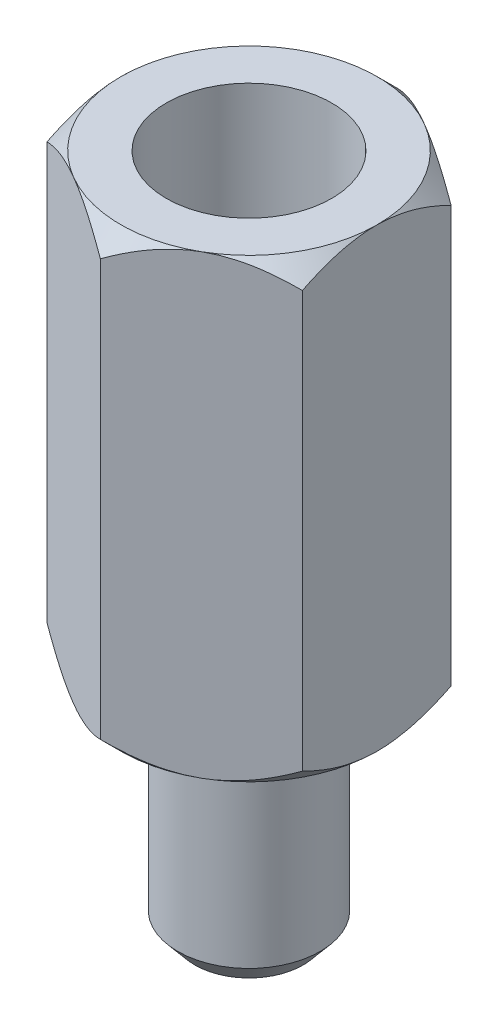
ISO-10303-21;
HEADER;
FILE_DESCRIPTION(('STEP AP214'),'2;1');
FILE_NAME('part.step','',(''),(''),'','','');
FILE_SCHEMA(('AUTOMOTIVE_DESIGN { 1 0 10303 214 1 1 1 1 }'));
ENDSEC;
DATA;
#1=APPLICATION_CONTEXT('core data for automotive mechanical design processes');
#2=APPLICATION_PROTOCOL_DEFINITION('international standard','automotive_design',2000,#1);
#3=PRODUCT_CONTEXT('',#1,'mechanical');
#4=PRODUCT('Part','Part','',(#3));
#5=PRODUCT_RELATED_PRODUCT_CATEGORY('part','',(#4));
#6=PRODUCT_DEFINITION_FORMATION('','',#4);
#7=PRODUCT_DEFINITION_CONTEXT('part definition',#1,'design');
#8=PRODUCT_DEFINITION('design','',#6,#7);
#9=PRODUCT_DEFINITION_SHAPE('','',#8);
#10=(LENGTH_UNIT() NAMED_UNIT(*) SI_UNIT(.MILLI.,.METRE.));
#11=(NAMED_UNIT(*) PLANE_ANGLE_UNIT() SI_UNIT($,.RADIAN.));
#12=(NAMED_UNIT(*) SI_UNIT($,.STERADIAN.) SOLID_ANGLE_UNIT());
#13=UNCERTAINTY_MEASURE_WITH_UNIT(LENGTH_MEASURE(1.E-05),#10,'distance_accuracy_value','');
#14=(GEOMETRIC_REPRESENTATION_CONTEXT(3) GLOBAL_UNCERTAINTY_ASSIGNED_CONTEXT((#13)) GLOBAL_UNIT_ASSIGNED_CONTEXT((#10,
#11,#12)) REPRESENTATION_CONTEXT('',''));
#15=CARTESIAN_POINT('',(0.,0.,0.));
#16=DIRECTION('',(0.,0.,1.));
#17=DIRECTION('',(1.,0.,0.));
#18=AXIS2_PLACEMENT_3D('',#15,#16,#17);
#19=CARTESIAN_POINT('',(-0.0101617648851617,11.9,2.598056338599));
#20=DIRECTION('',(-0.496608920524927,0.,-0.867974412096962));
#21=DIRECTION('',(-0.867974412096962,0.,0.496608920524927));
#22=AXIS2_PLACEMENT_3D('',#19,#20,#21);
#23=PLANE('',#22);
#24=CARTESIAN_POINT('',(2.24510190724733,4.24819142978603,1.3077140864455));
#25=CARTESIAN_POINT('',(2.16758221048221,4.20357287861617,1.35206674522601));
#26=CARTESIAN_POINT('',(2.08876626086339,4.1615747410601,1.39716105113508));
#27=CARTESIAN_POINT('',(1.92805174432769,4.08467697602207,1.48911337306662));
#28=CARTESIAN_POINT('',(1.84613789120632,4.04982013722574,1.5359801350445));
#29=CARTESIAN_POINT('',(1.68096249412416,3.99010959464983,1.63048473621595));
#30=CARTESIAN_POINT('',(1.59774302095716,3.96510580206295,1.67809850473279));
#31=CARTESIAN_POINT('',(1.4294719177633,3.92658218212804,1.77437430474255));
#32=CARTESIAN_POINT('',(1.34442542895298,3.91303359564264,1.82303339470408));
#33=CARTESIAN_POINT('',(1.19785383592409,3.90080932467072,1.90689388595732));
#34=CARTESIAN_POINT('',(1.13651811341635,3.89899963694501,1.94198693307906));
#35=CARTESIAN_POINT('',(1.0139469142098,3.90204771339328,2.0121156719878));
#36=CARTESIAN_POINT('',(0.952711480190224,3.90690781510189,2.047151339356));
#37=CARTESIAN_POINT('',(0.830818801316613,3.92301890113209,2.1168918649195));
#38=CARTESIAN_POINT('',(0.770162280629989,3.93427703519974,2.15159630878462));
#39=CARTESIAN_POINT('',(0.649898131645371,3.96256619499084,2.22040507592421));
#40=CARTESIAN_POINT('',(0.590290423310529,3.97959677818034,2.25450944499151));
#41=CARTESIAN_POINT('',(0.437605672591457,4.03015713675029,2.34186756082817));
#42=CARTESIAN_POINT('',(0.345475446941707,4.06749849987828,2.39457958928198));
#43=CARTESIAN_POINT('',(0.210006134980012,4.13053602733577,2.4720879441827));
#44=CARTESIAN_POINT('',(0.165362961965437,4.15268454392604,2.49763039987101));
#45=CARTESIAN_POINT('',(0.0769035957215761,4.19900061384041,2.54824215727818));
#46=CARTESIAN_POINT('',(0.0330869146886659,4.22316692742273,2.5733117380924));
#47=CARTESIAN_POINT('',(-0.0103617648851617,4.24819142978603,2.59817076799083));
#48=B_SPLINE_CURVE_WITH_KNOTS('',3,(#24,#25,#26,#27,#28,#29,#30,#31,#32,#33,#34,#35,#36,#37,#38,
#39,#40,#41,#42,#43,#44,#45,#46,#47),.UNSPECIFIED.,.F.,.F.,(4,2,2,2,2,2,2,2,2,2,2,4),(0.,
0.299716226455268,0.601178886155479,0.897853335211527,1.19378073070828,1.40554616396217,
1.6173858327627,1.82946269737901,2.04152330719783,2.37837839572747,2.54634924679826,
2.71421764485177),.UNSPECIFIED.);
#49=CARTESIAN_POINT('',(2.24490190724733,4.24807621135331,1.30782851583733));
#50=VERTEX_POINT('',#49);
#51=CARTESIAN_POINT('',(1.11737007118109,3.9,1.95294242721816));
#52=VERTEX_POINT('',#51);
#53=EDGE_CURVE('E129',#50,#52,#48,.T.);
#54=ORIENTED_EDGE('',*,*,#53,.F.);
#55=DIRECTION('',(0.,-1.,0.));
#56=VECTOR('',#55,1.);
#57=CARTESIAN_POINT('',(2.24490190724733,11.9,1.30782851583733));
#58=LINE('',#57,#56);
#59=CARTESIAN_POINT('',(2.24490190724733,11.5519237886467,1.30782851583733));
#60=VERTEX_POINT('',#59);
#61=EDGE_CURVE('E343',#60,#50,#58,.T.);
#62=ORIENTED_EDGE('',*,*,#61,.F.);
#63=CARTESIAN_POINT('',(-0.0103617648851616,11.551808570214,2.59817076799083));
#64=CARTESIAN_POINT('',(0.0671579318799628,11.5964271213838,2.55381810921032));
#65=CARTESIAN_POINT('',(0.145973881498785,11.6384252589399,2.50872380330125));
#66=CARTESIAN_POINT('',(0.306688398034488,11.7153230239779,2.41677148136971));
#67=CARTESIAN_POINT('',(0.388602251155848,11.7501798627743,2.36990471939183));
#68=CARTESIAN_POINT('',(0.553777648238013,11.8098904053502,2.27540011822038));
#69=CARTESIAN_POINT('',(0.636997121405014,11.8348941979371,2.22778634970354));
#70=CARTESIAN_POINT('',(0.80526822459887,11.873417817872,2.13151054969378));
#71=CARTESIAN_POINT('',(0.890314713409193,11.8869664043574,2.08285145973225));
#72=CARTESIAN_POINT('',(1.03688630643808,11.8991906753293,1.99899096847901));
#73=CARTESIAN_POINT('',(1.09822202894583,11.901000363055,1.96389792135727));
#74=CARTESIAN_POINT('',(1.22079322815237,11.8979522866067,1.89376918244853));
#75=CARTESIAN_POINT('',(1.28202866217195,11.8930921848981,1.85873351508034));
#76=CARTESIAN_POINT('',(1.40392134104556,11.8769810988679,1.78899298951683));
#77=CARTESIAN_POINT('',(1.46457786173218,11.8657229648003,1.75428854565171));
#78=CARTESIAN_POINT('',(1.5848420107168,11.8374338050092,1.68547977851212));
#79=CARTESIAN_POINT('',(1.64444971905164,11.8204032218197,1.65137540944482));
#80=CARTESIAN_POINT('',(1.79713446977071,11.7698428632497,1.56401729360817));
#81=CARTESIAN_POINT('',(1.88926469542047,11.7325015001217,1.51130526515435));
#82=CARTESIAN_POINT('',(2.02473400738216,11.6694639726642,1.43379691025363));
#83=CARTESIAN_POINT('',(2.06937718039674,11.647315456074,1.40825445456532));
#84=CARTESIAN_POINT('',(2.1578365466406,11.6009993861596,1.35764269715815));
#85=CARTESIAN_POINT('',(2.20165322767351,11.5768330725773,1.33257311634393));
#86=CARTESIAN_POINT('',(2.24510190724733,11.551808570214,1.3077140864455));
#87=B_SPLINE_CURVE_WITH_KNOTS('',3,(#63,#64,#65,#66,#67,#68,#69,#70,#71,#72,#73,#74,#75,#76,#77,
#78,#79,#80,#81,#82,#83,#84,#85,#86),.UNSPECIFIED.,.F.,.F.,(4,2,2,2,2,2,2,2,2,2,2,4),(0.,
0.299716226455268,0.601178886155478,0.897853335211526,1.19378073070828,1.40554616396217,
1.61738583276269,1.82946269737901,2.04152330719783,2.37837839572747,2.54634924679826,
2.71421764485177),.UNSPECIFIED.);
#88=CARTESIAN_POINT('',(1.11737007118109,11.9,1.95294242721817));
#89=VERTEX_POINT('',#88);
#90=EDGE_CURVE('E310',#89,#60,#87,.T.);
#91=ORIENTED_EDGE('',*,*,#90,.F.);
#92=CARTESIAN_POINT('',(-0.0101617648851614,11.5519237886467,2.598056338599));
#93=VERTEX_POINT('',#92);
#94=EDGE_CURVE('E548',#93,#89,#87,.T.);
#95=ORIENTED_EDGE('',*,*,#94,.F.);
#96=DIRECTION('',(0.,-1.,0.));
#97=VECTOR('',#96,1.);
#98=CARTESIAN_POINT('',(-0.0101617648851617,11.9,2.598056338599));
#99=LINE('',#98,#97);
#100=CARTESIAN_POINT('',(-0.0101617648851617,4.24807621135331,2.598056338599));
#101=VERTEX_POINT('',#100);
#102=EDGE_CURVE('E163',#93,#101,#99,.T.);
#103=ORIENTED_EDGE('',*,*,#102,.T.);
#104=EDGE_CURVE('E142',#52,#101,#48,.T.);
#105=ORIENTED_EDGE('',*,*,#104,.F.);
#106=EDGE_LOOP('',(#54,#62,#91,#95,#103,#105));
#107=FACE_BOUND('',#106,.T.);
#108=ADVANCED_FACE('F39',(#107),#23,.F.);
#109=CARTESIAN_POINT('',(2.24490190724733,11.9,1.30782851583733));
#110=DIRECTION('',(-0.999992350973296,0.,-0.00391126512792664));
#111=DIRECTION('',(-0.00391126512792664,0.,0.999992350973296));
#112=AXIS2_PLACEMENT_3D('',#109,#110,#111);
#113=PLANE('',#112);
#114=CARTESIAN_POINT('',(2.25506445439151,4.24817621789159,-1.29042782276166));
#115=CARTESIAN_POINT('',(2.25471514241201,4.20355936010298,-1.20111930079291));
#116=CARTESIAN_POINT('',(2.25435998945213,4.16156288797823,-1.1103174165724));
#117=CARTESIAN_POINT('',(2.25363579335518,4.08466830008323,-0.925162349384262));
#118=CARTESIAN_POINT('',(2.25326668134321,4.04981296901563,-0.830791557185245));
#119=CARTESIAN_POINT('',(2.25252238456701,3.99010508086132,-0.640497353464823));
#120=CARTESIAN_POINT('',(2.25214738936113,3.96510244812592,-0.544622406290025));
#121=CARTESIAN_POINT('',(2.25138914341918,3.92658068310196,-0.350761822231609));
#122=CARTESIAN_POINT('',(2.25100591584727,3.91303279484249,-0.252782107724048));
#123=CARTESIAN_POINT('',(2.25034544438296,3.90080910458387,-0.0839195042581476));
#124=CARTESIAN_POINT('',(2.2500690537766,3.89899958806528,-0.0132547747655743));
#125=CARTESIAN_POINT('',(2.24951672435585,3.90204798751909,0.127959174659623));
#126=CARTESIAN_POINT('',(2.2492407857338,3.90690824094884,0.198508345417544));
#127=CARTESIAN_POINT('',(2.24869151399196,3.92301960155469,0.338940538704918));
#128=CARTESIAN_POINT('',(2.2484181841352,3.93427785786006,0.408822726978326));
#129=CARTESIAN_POINT('',(2.2478762509552,3.96256723006092,0.547378671669959));
#130=CARTESIAN_POINT('',(2.24760764727128,3.97959790339854,0.616052520304334));
#131=CARTESIAN_POINT('',(2.24691964416859,4.0301567323759,0.791954132092262));
#132=CARTESIAN_POINT('',(2.2465045105134,4.06749575093892,0.898091268348868));
#133=CARTESIAN_POINT('',(2.2458940926979,4.13052905559549,1.05415666571606));
#134=CARTESIAN_POINT('',(2.24569293274202,4.15267604718984,1.10558719027197));
#135=CARTESIAN_POINT('',(2.24529433894253,4.19898888479474,1.20749558502374));
#136=CARTESIAN_POINT('',(2.24509690290157,4.22315349148652,1.25797401701734));
#137=CARTESIAN_POINT('',(2.24490112498833,4.24817621789159,1.30802851583733));
#138=B_SPLINE_CURVE_WITH_KNOTS('',3,(#114,#115,#116,#117,#118,#119,#120,#121,#122,#123,#124,
#125,#126,#127,#128,#129,#130,#131,#132,#133,#134,#135,#136,#137),.UNSPECIFIED.,.F.,.F.,(4,2,2,
2,2,2,2,2,2,2,2,4),(0.,0.299709017685869,0.60116430690092,0.897831767021641,1.19375224351276,
1.40551739990353,1.61735678950675,1.82943335521307,2.04149366517593,2.37832957865059,
2.54629083832152,2.71414967637735),.UNSPECIFIED.);
#139=CARTESIAN_POINT('',(2.2550636721325,4.24807621135331,-1.29022782276166));
#140=VERTEX_POINT('',#139);
#141=CARTESIAN_POINT('',(2.24998278968992,3.9,0.00880034653783495));
#142=VERTEX_POINT('',#141);
#143=EDGE_CURVE('E55',#140,#142,#138,.T.);
#144=ORIENTED_EDGE('',*,*,#143,.F.);
#145=DIRECTION('',(0.,-1.,0.));
#146=VECTOR('',#145,1.);
#147=CARTESIAN_POINT('',(2.2550636721325,11.9,-1.29022782276166));
#148=LINE('',#147,#146);
#149=CARTESIAN_POINT('',(2.2550636721325,11.5519237886467,-1.29022782276166));
#150=VERTEX_POINT('',#149);
#151=EDGE_CURVE('E306',#150,#140,#148,.T.);
#152=ORIENTED_EDGE('',*,*,#151,.F.);
#153=CARTESIAN_POINT('',(2.24490112498833,11.5518237821084,1.30802851583733));
#154=CARTESIAN_POINT('',(2.24525043696782,11.596440639897,1.21871999386859));
#155=CARTESIAN_POINT('',(2.2456055899277,11.6384371120218,1.12791810964807));
#156=CARTESIAN_POINT('',(2.24632978602465,11.7153316999168,0.942763042459932));
#157=CARTESIAN_POINT('',(2.24669889803662,11.7501870309844,0.848392250260916));
#158=CARTESIAN_POINT('',(2.24744319481282,11.8098949191387,0.658098046540493));
#159=CARTESIAN_POINT('',(2.2478181900187,11.8348975518741,0.562223099365695));
#160=CARTESIAN_POINT('',(2.24857643596065,11.873419316898,0.368362515307279));
#161=CARTESIAN_POINT('',(2.24895966353256,11.8869672051575,0.270382800799717));
#162=CARTESIAN_POINT('',(2.24962013499688,11.8991908954161,0.101520197333817));
#163=CARTESIAN_POINT('',(2.24989652560323,11.9010004119347,0.0308554678412435));
#164=CARTESIAN_POINT('',(2.25044885502398,11.8979520124809,-0.110358481583954));
#165=CARTESIAN_POINT('',(2.25072479364603,11.8930917590512,-0.180907652341874));
#166=CARTESIAN_POINT('',(2.25127406538787,11.8769803984453,-0.321339845629249));
#167=CARTESIAN_POINT('',(2.25154739524463,11.8657221421399,-0.391222033902657));
#168=CARTESIAN_POINT('',(2.25208932842463,11.8374327699391,-0.52977797859429));
#169=CARTESIAN_POINT('',(2.25235793210855,11.8204020966015,-0.598451827228665));
#170=CARTESIAN_POINT('',(2.25304593521124,11.7698432676241,-0.774353439016593));
#171=CARTESIAN_POINT('',(2.25346106886643,11.7325042490611,-0.880490575273199));
#172=CARTESIAN_POINT('',(2.25407148668193,11.6694709444045,-1.03655597264039));
#173=CARTESIAN_POINT('',(2.25427264663781,11.6473239528102,-1.0879864971963));
#174=CARTESIAN_POINT('',(2.2546712404373,11.6010111152053,-1.18989489194807));
#175=CARTESIAN_POINT('',(2.25486867647826,11.5768465085135,-1.24037332394167));
#176=CARTESIAN_POINT('',(2.25506445439151,11.5518237821084,-1.29042782276166));
#177=B_SPLINE_CURVE_WITH_KNOTS('',3,(#153,#154,#155,#156,#157,#158,#159,#160,#161,#162,#163,
#164,#165,#166,#167,#168,#169,#170,#171,#172,#173,#174,#175,#176),.UNSPECIFIED.,.F.,.F.,(4,2,2,
2,2,2,2,2,2,2,2,4),(0.,0.29970901768587,0.601164306900922,0.897831767021643,1.19375224351276,
1.40551739990354,1.61735678950675,1.82943335521307,2.04149366517593,2.37832957865059,
2.54629083832152,2.71414967637735),.UNSPECIFIED.);
#178=CARTESIAN_POINT('',(2.24998278968992,11.9,0.00880034653783495));
#179=VERTEX_POINT('',#178);
#180=EDGE_CURVE('E272',#179,#150,#177,.T.);
#181=ORIENTED_EDGE('',*,*,#180,.F.);
#182=EDGE_CURVE('E304',#60,#179,#177,.T.);
#183=ORIENTED_EDGE('',*,*,#182,.F.);
#184=ORIENTED_EDGE('',*,*,#61,.T.);
#185=EDGE_CURVE('E136',#142,#50,#138,.T.);
#186=ORIENTED_EDGE('',*,*,#185,.F.);
#187=EDGE_LOOP('',(#144,#152,#181,#183,#184,#186));
#188=FACE_BOUND('',#187,.T.);
#189=ADVANCED_FACE('F265',(#188),#113,.F.);
#190=CARTESIAN_POINT('',(2.2550636721325,11.9,-1.29022782276166));
#191=DIRECTION('',(-0.503383430448369,0.,0.864063146969035));
#192=DIRECTION('',(0.864063146969035,0.,0.503383430448369));
#193=AXIS2_PLACEMENT_3D('',#190,#191,#192);
#194=PLANE('',#193);
#195=CARTESIAN_POINT('',(0.00996176488516261,4.24819195136822,-2.59817285402549));
#196=CARTESIAN_POINT('',(0.087132196837072,4.20357334213559,-2.55321512506621));
#197=CARTESIAN_POINT('',(0.165593041927878,4.16157514747512,-2.50750563092076));
#198=CARTESIAN_POINT('',(0.325583463890154,4.08467727349908,-2.41429886966869));
#199=CARTESIAN_POINT('',(0.407128258142322,4.04982038300571,-2.36679273726407));
#200=CARTESIAN_POINT('',(0.571559466117009,3.99010974941518,-2.27099887563091));
#201=CARTESIAN_POINT('',(0.654403998466034,3.96510591705952,-2.22273554553284));
#202=CARTESIAN_POINT('',(0.821916967995333,3.92658223352414,-2.12514632009018));
#203=CARTESIAN_POINT('',(0.906580287102308,3.91303362309848,-2.07582340641806));
#204=CARTESIAN_POINT('',(1.05249146949085,3.90080933221638,-1.99081888818445));
#205=CARTESIAN_POINT('',(1.11355080365351,3.89899963862099,-1.95524711637644));
#206=CARTESIAN_POINT('',(1.23556967838548,3.90204770399546,-1.88416171022588));
#207=CARTESIAN_POINT('',(1.29652917646801,3.90690780050258,-1.84864810063515));
#208=CARTESIAN_POINT('',(1.4178725894104,3.92301887711962,-1.77795620307706));
#209=CARTESIAN_POINT('',(1.47825578336443,3.93427700699672,-1.74277833509295));
#210=CARTESIAN_POINT('',(1.59797800552291,3.96256615950618,-1.67303090621297));
#211=CARTESIAN_POINT('',(1.65731711340338,3.97959673960541,-1.63846129889967));
#212=CARTESIAN_POINT('',(1.80931402351354,4.03015715062144,-1.5499113748609));
#213=CARTESIAN_POINT('',(1.90102926963931,4.06749859413847,-1.49648016976767));
#214=CARTESIAN_POINT('',(2.03588838610823,4.13053626638481,-1.41791433240556));
#215=CARTESIAN_POINT('',(2.08033047181727,4.15268483526321,-1.39202338955147));
#216=CARTESIAN_POINT('',(2.16839138678177,4.19900101600498,-1.34072111422733));
#217=CARTESIAN_POINT('',(2.21201070164864,4.22316738811206,-1.31530949885117));
#218=CARTESIAN_POINT('',(2.2552636721325,4.24819195136822,-1.29011130733516));
#219=B_SPLINE_CURVE_WITH_KNOTS('',3,(#195,#196,#197,#198,#199,#200,#201,#202,#203,#204,#205,
#206,#207,#208,#209,#210,#211,#212,#213,#214,#215,#216,#217,#218),.UNSPECIFIED.,.F.,.F.,(4,2,2,
2,2,2,2,2,2,2,2,4),(0.,0.29971647363104,0.601179386052122,0.897854074745999,1.19378170748275,
1.40554715023087,1.61738682860567,1.82946370347216,2.04152432357358,2.3783800695566,
2.54635124948698,2.7142199753233),.UNSPECIFIED.);
#220=CARTESIAN_POINT('',(0.0101617648851624,4.24807621135331,-2.598056338599));
#221=VERTEX_POINT('',#220);
#222=CARTESIAN_POINT('',(1.13261271850883,3.9,-1.94414208068033));
#223=VERTEX_POINT('',#222);
#224=EDGE_CURVE('E63',#221,#223,#219,.T.);
#225=ORIENTED_EDGE('',*,*,#224,.F.);
#226=DIRECTION('',(0.,-1.,0.));
#227=VECTOR('',#226,1.);
#228=CARTESIAN_POINT('',(0.0101617648851626,11.9,-2.598056338599));
#229=LINE('',#228,#227);
#230=CARTESIAN_POINT('',(0.0101617648851624,11.5519237886467,-2.598056338599));
#231=VERTEX_POINT('',#230);
#232=EDGE_CURVE('E334',#231,#221,#229,.T.);
#233=ORIENTED_EDGE('',*,*,#232,.F.);
#234=CARTESIAN_POINT('',(2.2552636721325,11.5518080486318,-1.29011130733516));
#235=CARTESIAN_POINT('',(2.17809324018059,11.5964266578644,-1.33506903629444));
#236=CARTESIAN_POINT('',(2.09963239508978,11.6384248525249,-1.3807785304399));
#237=CARTESIAN_POINT('',(1.93964197312751,11.7153227265009,-1.47398529169197));
#238=CARTESIAN_POINT('',(1.85809717887534,11.7501796169943,-1.52149142409659));
#239=CARTESIAN_POINT('',(1.69366597090065,11.8098902505848,-1.61728528572975));
#240=CARTESIAN_POINT('',(1.61082143855163,11.8348940829405,-1.66554861582782));
#241=CARTESIAN_POINT('',(1.44330846902233,11.8734177664759,-1.76313784127048));
#242=CARTESIAN_POINT('',(1.35864514991535,11.8869663769015,-1.8124607549426));
#243=CARTESIAN_POINT('',(1.21273396752681,11.8991906677836,-1.89746527317621));
#244=CARTESIAN_POINT('',(1.15167463336415,11.901000361379,-1.93303704498422));
#245=CARTESIAN_POINT('',(1.02965575863218,11.8979522960045,-2.00412245113478));
#246=CARTESIAN_POINT('',(0.968696260549654,11.8930921994974,-2.03963606072551));
#247=CARTESIAN_POINT('',(0.84735284760726,11.8769811228804,-2.1103279582836));
#248=CARTESIAN_POINT('',(0.786969653653231,11.8657229930033,-2.1455058262677));
#249=CARTESIAN_POINT('',(0.667247431494747,11.8374338404938,-2.21525325514769));
#250=CARTESIAN_POINT('',(0.607908323614277,11.8204032603946,-2.24982286246099));
#251=CARTESIAN_POINT('',(0.455911413504118,11.7698428493786,-2.33837278649976));
#252=CARTESIAN_POINT('',(0.364196167378348,11.7325014058615,-2.39180399159299));
#253=CARTESIAN_POINT('',(0.22933705090943,11.6694637336152,-2.4703698289551));
#254=CARTESIAN_POINT('',(0.18489496520039,11.6473151647368,-2.49626077180918));
#255=CARTESIAN_POINT('',(0.096834050235892,11.600998983995,-2.54756304713333));
#256=CARTESIAN_POINT('',(0.0532147353690158,11.5768326118879,-2.57297466250949));
#257=CARTESIAN_POINT('',(0.00996176488516213,11.5518080486318,-2.59817285402549));
#258=B_SPLINE_CURVE_WITH_KNOTS('',3,(#234,#235,#236,#237,#238,#239,#240,#241,#242,#243,#244,
#245,#246,#247,#248,#249,#250,#251,#252,#253,#254,#255,#256,#257),.UNSPECIFIED.,.F.,.F.,(4,2,2,
2,2,2,2,2,2,2,2,4),(0.,0.299716473631039,0.601179386052121,0.897854074745999,1.19378170748275,
1.40554715023088,1.61738682860567,1.82946370347216,2.04152432357358,2.3783800695566,
2.54635124948698,2.7142199753233),.UNSPECIFIED.);
#259=CARTESIAN_POINT('',(1.13261271850883,11.9,-1.94414208068033));
#260=VERTEX_POINT('',#259);
#261=EDGE_CURVE('E251',#260,#231,#258,.T.);
#262=ORIENTED_EDGE('',*,*,#261,.F.);
#263=EDGE_CURVE('E309',#150,#260,#258,.T.);
#264=ORIENTED_EDGE('',*,*,#263,.F.);
#265=ORIENTED_EDGE('',*,*,#151,.T.);
#266=EDGE_CURVE('E202',#223,#140,#219,.T.);
#267=ORIENTED_EDGE('',*,*,#266,.F.);
#268=EDGE_LOOP('',(#225,#233,#262,#264,#265,#267));
#269=FACE_BOUND('',#268,.T.);
#270=ADVANCED_FACE('F260',(#269),#194,.F.);
#271=CARTESIAN_POINT('',(0.0101617648851626,11.9,-2.598056338599));
#272=DIRECTION('',(0.496608920524927,0.,0.867974412096962));
#273=DIRECTION('',(0.867974412096962,0.,-0.496608920524927));
#274=AXIS2_PLACEMENT_3D('',#271,#272,#273);
#275=PLANE('',#274);
#276=CARTESIAN_POINT('',(-2.24510190724733,4.24819142978603,-1.3077140864455));
#277=CARTESIAN_POINT('',(-2.16758221048221,4.20357287861617,-1.352066745226));
#278=CARTESIAN_POINT('',(-2.08876626086339,4.1615747410601,-1.39716105113508));
#279=CARTESIAN_POINT('',(-1.92805174432769,4.08467697602207,-1.48911337306662));
#280=CARTESIAN_POINT('',(-1.84613789120632,4.04982013722574,-1.5359801350445));
#281=CARTESIAN_POINT('',(-1.68096249412416,3.99010959464983,-1.63048473621595));
#282=CARTESIAN_POINT('',(-1.59774302095716,3.96510580206295,-1.67809850473279));
#283=CARTESIAN_POINT('',(-1.4294719177633,3.92658218212803,-1.77437430474255));
#284=CARTESIAN_POINT('',(-1.34442542895298,3.91303359564264,-1.82303339470408));
#285=CARTESIAN_POINT('',(-1.19785383592409,3.90080932467072,-1.90689388595732));
#286=CARTESIAN_POINT('',(-1.13651811341634,3.89899963694501,-1.94198693307906));
#287=CARTESIAN_POINT('',(-1.0139469142098,3.90204771339328,-2.0121156719878));
#288=CARTESIAN_POINT('',(-0.952711480190223,3.90690781510189,-2.04715133935599));
#289=CARTESIAN_POINT('',(-0.830818801316613,3.92301890113209,-2.1168918649195));
#290=CARTESIAN_POINT('',(-0.770162280629988,3.93427703519974,-2.15159630878462));
#291=CARTESIAN_POINT('',(-0.64989813164537,3.96256619499083,-2.22040507592421));
#292=CARTESIAN_POINT('',(-0.590290423310529,3.97959677818034,-2.25450944499151));
#293=CARTESIAN_POINT('',(-0.437605672591456,4.03015713675029,-2.34186756082816));
#294=CARTESIAN_POINT('',(-0.345475446941706,4.06749849987827,-2.39457958928198));
#295=CARTESIAN_POINT('',(-0.210006134980011,4.13053602733577,-2.4720879441827));
#296=CARTESIAN_POINT('',(-0.165362961965436,4.15268454392604,-2.49763039987101));
#297=CARTESIAN_POINT('',(-0.0769035957215751,4.19900061384041,-2.54824215727818));
#298=CARTESIAN_POINT('',(-0.033086914688665,4.22316692742273,-2.5733117380924));
#299=CARTESIAN_POINT('',(0.0103617648851626,4.24819142978603,-2.59817076799083));
#300=B_SPLINE_CURVE_WITH_KNOTS('',3,(#276,#277,#278,#279,#280,#281,#282,#283,#284,#285,#286,
#287,#288,#289,#290,#291,#292,#293,#294,#295,#296,#297,#298,#299),.UNSPECIFIED.,.F.,.F.,(4,2,2,
2,2,2,2,2,2,2,2,4),(0.,0.299716226455268,0.60117888615548,0.897853335211528,1.19378073070828,
1.40554616396218,1.6173858327627,1.82946269737901,2.04152330719784,2.37837839572747,
2.54634924679826,2.71421764485177),.UNSPECIFIED.);
#301=CARTESIAN_POINT('',(-2.24490190724733,4.24807621135331,-1.30782851583733));
#302=VERTEX_POINT('',#301);
#303=CARTESIAN_POINT('',(-1.11737007118109,3.9,-1.95294242721816));
#304=VERTEX_POINT('',#303);
#305=EDGE_CURVE('E179',#302,#304,#300,.T.);
#306=ORIENTED_EDGE('',*,*,#305,.F.);
#307=DIRECTION('',(0.,-1.,0.));
#308=VECTOR('',#307,1.);
#309=CARTESIAN_POINT('',(-2.24490190724733,11.9,-1.30782851583733));
#310=LINE('',#309,#308);
#311=CARTESIAN_POINT('',(-2.24490190724733,11.5519237886467,-1.30782851583733));
#312=VERTEX_POINT('',#311);
#313=EDGE_CURVE('E331',#312,#302,#310,.T.);
#314=ORIENTED_EDGE('',*,*,#313,.F.);
#315=CARTESIAN_POINT('',(0.0103617648851623,11.551808570214,-2.59817076799083));
#316=CARTESIAN_POINT('',(-0.0671579318799624,11.5964271213838,-2.55381810921032));
#317=CARTESIAN_POINT('',(-0.145973881498785,11.6384252589399,-2.50872380330125));
#318=CARTESIAN_POINT('',(-0.306688398034488,11.7153230239779,-2.4167714813697));
#319=CARTESIAN_POINT('',(-0.388602251155848,11.7501798627743,-2.36990471939183));
#320=CARTESIAN_POINT('',(-0.553777648238013,11.8098904053502,-2.27540011822037));
#321=CARTESIAN_POINT('',(-0.636997121405014,11.8348941979371,-2.22778634970354));
#322=CARTESIAN_POINT('',(-0.80526822459887,11.873417817872,-2.13151054969378));
#323=CARTESIAN_POINT('',(-0.890314713409193,11.8869664043574,-2.08285145973225));
#324=CARTESIAN_POINT('',(-1.03688630643808,11.8991906753293,-1.99899096847901));
#325=CARTESIAN_POINT('',(-1.09822202894583,11.901000363055,-1.96389792135727));
#326=CARTESIAN_POINT('',(-1.22079322815237,11.8979522866067,-1.89376918244853));
#327=CARTESIAN_POINT('',(-1.28202866217195,11.8930921848981,-1.85873351508033));
#328=CARTESIAN_POINT('',(-1.40392134104556,11.8769810988679,-1.78899298951683));
#329=CARTESIAN_POINT('',(-1.46457786173218,11.8657229648003,-1.75428854565171));
#330=CARTESIAN_POINT('',(-1.5848420107168,11.8374338050092,-1.68547977851212));
#331=CARTESIAN_POINT('',(-1.64444971905164,11.8204032218197,-1.65137540944482));
#332=CARTESIAN_POINT('',(-1.79713446977071,11.7698428632497,-1.56401729360816));
#333=CARTESIAN_POINT('',(-1.88926469542047,11.7325015001217,-1.51130526515435));
#334=CARTESIAN_POINT('',(-2.02473400738216,11.6694639726642,-1.43379691025363));
#335=CARTESIAN_POINT('',(-2.06937718039674,11.647315456074,-1.40825445456532));
#336=CARTESIAN_POINT('',(-2.1578365466406,11.6009993861596,-1.35764269715815));
#337=CARTESIAN_POINT('',(-2.20165322767351,11.5768330725773,-1.33257311634393));
#338=CARTESIAN_POINT('',(-2.24510190724733,11.551808570214,-1.3077140864455));
#339=B_SPLINE_CURVE_WITH_KNOTS('',3,(#315,#316,#317,#318,#319,#320,#321,#322,#323,#324,#325,
#326,#327,#328,#329,#330,#331,#332,#333,#334,#335,#336,#337,#338),.UNSPECIFIED.,.F.,.F.,(4,2,2,
2,2,2,2,2,2,2,2,4),(0.,0.299716226455268,0.601178886155479,0.897853335211527,1.19378073070828,
1.40554616396217,1.61738583276269,1.82946269737901,2.04152330719783,2.37837839572747,
2.54634924679826,2.71421764485177),.UNSPECIFIED.);
#340=CARTESIAN_POINT('',(-1.11737007118109,11.9,-1.95294242721817));
#341=VERTEX_POINT('',#340);
#342=EDGE_CURVE('E244',#341,#312,#339,.T.);
#343=ORIENTED_EDGE('',*,*,#342,.F.);
#344=EDGE_CURVE('E250',#231,#341,#339,.T.);
#345=ORIENTED_EDGE('',*,*,#344,.F.);
#346=ORIENTED_EDGE('',*,*,#232,.T.);
#347=EDGE_CURVE('E282',#304,#221,#300,.T.);
#348=ORIENTED_EDGE('',*,*,#347,.F.);
#349=EDGE_LOOP('',(#306,#314,#343,#345,#346,#348));
#350=FACE_BOUND('',#349,.T.);
#351=ADVANCED_FACE('F257',(#350),#275,.F.);
#352=CARTESIAN_POINT('',(-2.24490190724733,11.9,-1.30782851583733));
#353=DIRECTION('',(0.999992350973296,0.,0.00391126512792665));
#354=DIRECTION('',(0.00391126512792665,0.,-0.999992350973296));
#355=AXIS2_PLACEMENT_3D('',#352,#353,#354);
#356=PLANE('',#355);
#357=CARTESIAN_POINT('',(-2.25506445439151,4.24817621789159,1.29042782276166));
#358=CARTESIAN_POINT('',(-2.25471514241201,4.20355936010298,1.20111930079291));
#359=CARTESIAN_POINT('',(-2.25435998945213,4.16156288797823,1.1103174165724));
#360=CARTESIAN_POINT('',(-2.25363579335518,4.08466830008323,0.925162349384262));
#361=CARTESIAN_POINT('',(-2.25326668134321,4.04981296901563,0.830791557185246));
#362=CARTESIAN_POINT('',(-2.25252238456701,3.99010508086132,0.640497353464823));
#363=CARTESIAN_POINT('',(-2.25214738936113,3.96510244812592,0.544622406290025));
#364=CARTESIAN_POINT('',(-2.25138914341918,3.92658068310196,0.350761822231609));
#365=CARTESIAN_POINT('',(-2.25100591584727,3.91303279484249,0.252782107724047));
#366=CARTESIAN_POINT('',(-2.25034544438296,3.90080910458387,0.0839195042581469));
#367=CARTESIAN_POINT('',(-2.2500690537766,3.89899958806528,0.0132547747655738));
#368=CARTESIAN_POINT('',(-2.24951672435585,3.90204798751909,-0.127959174659624));
#369=CARTESIAN_POINT('',(-2.2492407857338,3.90690824094884,-0.198508345417544));
#370=CARTESIAN_POINT('',(-2.24869151399196,3.92301960155469,-0.338940538704919));
#371=CARTESIAN_POINT('',(-2.2484181841352,3.93427785786006,-0.408822726978327));
#372=CARTESIAN_POINT('',(-2.2478762509552,3.96256723006092,-0.54737867166996));
#373=CARTESIAN_POINT('',(-2.24760764727128,3.97959790339854,-0.616052520304335));
#374=CARTESIAN_POINT('',(-2.24691964416859,4.0301567323759,-0.791954132092262));
#375=CARTESIAN_POINT('',(-2.2465045105134,4.06749575093892,-0.898091268348868));
#376=CARTESIAN_POINT('',(-2.2458940926979,4.13052905559549,-1.05415666571606));
#377=CARTESIAN_POINT('',(-2.24569293274202,4.15267604718984,-1.10558719027197));
#378=CARTESIAN_POINT('',(-2.24529433894253,4.19898888479474,-1.20749558502374));
#379=CARTESIAN_POINT('',(-2.24509690290157,4.22315349148652,-1.25797401701734));
#380=CARTESIAN_POINT('',(-2.24490112498833,4.24817621789159,-1.30802851583733));
#381=B_SPLINE_CURVE_WITH_KNOTS('',3,(#357,#358,#359,#360,#361,#362,#363,#364,#365,#366,#367,
#368,#369,#370,#371,#372,#373,#374,#375,#376,#377,#378,#379,#380),.UNSPECIFIED.,.F.,.F.,(4,2,2,
2,2,2,2,2,2,2,2,4),(0.,0.299709017685868,0.60116430690092,0.897831767021641,1.19375224351276,
1.40551739990353,1.61735678950675,1.82943335521307,2.04149366517593,2.37832957865059,
2.54629083832152,2.71414967637735),.UNSPECIFIED.);
#382=CARTESIAN_POINT('',(-2.2550636721325,4.24807621135331,1.29022782276166));
#383=VERTEX_POINT('',#382);
#384=CARTESIAN_POINT('',(-2.24998278968992,3.9,-0.00880034653783495));
#385=VERTEX_POINT('',#384);
#386=EDGE_CURVE('E164',#383,#385,#381,.T.);
#387=ORIENTED_EDGE('',*,*,#386,.F.);
#388=DIRECTION('',(0.,-1.,0.));
#389=VECTOR('',#388,1.);
#390=CARTESIAN_POINT('',(-2.2550636721325,11.9,1.29022782276166));
#391=LINE('',#390,#389);
#392=CARTESIAN_POINT('',(-2.2550636721325,11.5519237886467,1.29022782276166));
#393=VERTEX_POINT('',#392);
#394=EDGE_CURVE('E335',#393,#383,#391,.T.);
#395=ORIENTED_EDGE('',*,*,#394,.F.);
#396=CARTESIAN_POINT('',(-2.24490112498833,11.5518237821084,-1.30802851583733));
#397=CARTESIAN_POINT('',(-2.24525043696783,11.596440639897,-1.21871999386859));
#398=CARTESIAN_POINT('',(-2.2456055899277,11.6384371120218,-1.12791810964807));
#399=CARTESIAN_POINT('',(-2.24632978602465,11.7153316999168,-0.942763042459932));
#400=CARTESIAN_POINT('',(-2.24669889803662,11.7501870309844,-0.848392250260915));
#401=CARTESIAN_POINT('',(-2.24744319481282,11.8098949191387,-0.658098046540492));
#402=CARTESIAN_POINT('',(-2.2478181900187,11.8348975518741,-0.562223099365694));
#403=CARTESIAN_POINT('',(-2.24857643596065,11.873419316898,-0.368362515307278));
#404=CARTESIAN_POINT('',(-2.24895966353256,11.8869672051575,-0.270382800799716));
#405=CARTESIAN_POINT('',(-2.24962013499688,11.8991908954161,-0.101520197333816));
#406=CARTESIAN_POINT('',(-2.24989652560323,11.9010004119347,-0.0308554678412424));
#407=CARTESIAN_POINT('',(-2.25044885502398,11.8979520124809,0.110358481583955));
#408=CARTESIAN_POINT('',(-2.25072479364603,11.8930917590512,0.180907652341875));
#409=CARTESIAN_POINT('',(-2.25127406538787,11.8769803984453,0.32133984562925));
#410=CARTESIAN_POINT('',(-2.25154739524463,11.8657221421399,0.391222033902658));
#411=CARTESIAN_POINT('',(-2.25208932842463,11.8374327699391,0.529777978594291));
#412=CARTESIAN_POINT('',(-2.25235793210855,11.8204020966015,0.598451827228666));
#413=CARTESIAN_POINT('',(-2.25304593521124,11.7698432676241,0.774353439016593));
#414=CARTESIAN_POINT('',(-2.25346106886643,11.7325042490611,0.880490575273198));
#415=CARTESIAN_POINT('',(-2.25407148668193,11.6694709444045,1.03655597264039));
#416=CARTESIAN_POINT('',(-2.25427264663781,11.6473239528102,1.0879864971963));
#417=CARTESIAN_POINT('',(-2.2546712404373,11.6010111152053,1.18989489194807));
#418=CARTESIAN_POINT('',(-2.25486867647827,11.5768465085135,1.24037332394167));
#419=CARTESIAN_POINT('',(-2.25506445439151,11.5518237821084,1.29042782276166));
#420=B_SPLINE_CURVE_WITH_KNOTS('',3,(#396,#397,#398,#399,#400,#401,#402,#403,#404,#405,#406,
#407,#408,#409,#410,#411,#412,#413,#414,#415,#416,#417,#418,#419),.UNSPECIFIED.,.F.,.F.,(4,2,2,
2,2,2,2,2,2,2,2,4),(0.,0.299709017685869,0.601164306900921,0.897831767021643,1.19375224351276,
1.40551739990354,1.61735678950675,1.82943335521307,2.04149366517593,2.37832957865059,
2.54629083832151,2.71414967637734),.UNSPECIFIED.);
#421=CARTESIAN_POINT('',(-2.24998278968992,11.9,-0.00880034653783496));
#422=VERTEX_POINT('',#421);
#423=EDGE_CURVE('E237',#422,#393,#420,.T.);
#424=ORIENTED_EDGE('',*,*,#423,.F.);
#425=EDGE_CURVE('E243',#312,#422,#420,.T.);
#426=ORIENTED_EDGE('',*,*,#425,.F.);
#427=ORIENTED_EDGE('',*,*,#313,.T.);
#428=EDGE_CURVE('E141',#385,#302,#381,.T.);
#429=ORIENTED_EDGE('',*,*,#428,.F.);
#430=EDGE_LOOP('',(#387,#395,#424,#426,#427,#429));
#431=FACE_BOUND('',#430,.T.);
#432=ADVANCED_FACE('F223',(#431),#356,.F.);
#433=CARTESIAN_POINT('',(-2.2550636721325,11.9,1.29022782276166));
#434=DIRECTION('',(0.503383430448369,0.,-0.864063146969035));
#435=DIRECTION('',(-0.864063146969035,0.,-0.503383430448369));
#436=AXIS2_PLACEMENT_3D('',#433,#434,#435);
#437=PLANE('',#436);
#438=CARTESIAN_POINT('',(-0.0099617648851617,4.24819195136822,2.59817285402549));
#439=CARTESIAN_POINT('',(-0.0871321968370712,4.20357334213559,2.55321512506622));
#440=CARTESIAN_POINT('',(-0.165593041927877,4.16157514747512,2.50750563092076));
#441=CARTESIAN_POINT('',(-0.325583463890153,4.08467727349908,2.41429886966869));
#442=CARTESIAN_POINT('',(-0.407128258142322,4.04982038300571,2.36679273726407));
#443=CARTESIAN_POINT('',(-0.571559466117009,3.99010974941519,2.27099887563091));
#444=CARTESIAN_POINT('',(-0.654403998466034,3.96510591705952,2.22273554553284));
#445=CARTESIAN_POINT('',(-0.821916967995334,3.92658223352414,2.12514632009018));
#446=CARTESIAN_POINT('',(-0.906580287102309,3.91303362309848,2.07582340641806));
#447=CARTESIAN_POINT('',(-1.05249146949085,3.90080933221638,1.99081888818445));
#448=CARTESIAN_POINT('',(-1.11355080365351,3.89899963862099,1.95524711637644));
#449=CARTESIAN_POINT('',(-1.23556967838548,3.90204770399546,1.88416171022588));
#450=CARTESIAN_POINT('',(-1.29652917646801,3.90690780050258,1.84864810063515));
#451=CARTESIAN_POINT('',(-1.4178725894104,3.92301887711962,1.77795620307706));
#452=CARTESIAN_POINT('',(-1.47825578336443,3.93427700699672,1.74277833509295));
#453=CARTESIAN_POINT('',(-1.59797800552291,3.96256615950618,1.67303090621297));
#454=CARTESIAN_POINT('',(-1.65731711340338,3.97959673960541,1.63846129889966));
#455=CARTESIAN_POINT('',(-1.80931402351354,4.03015715062144,1.5499113748609));
#456=CARTESIAN_POINT('',(-1.90102926963931,4.06749859413847,1.49648016976767));
#457=CARTESIAN_POINT('',(-2.03588838610823,4.13053626638481,1.41791433240556));
#458=CARTESIAN_POINT('',(-2.08033047181727,4.15268483526321,1.39202338955147));
#459=CARTESIAN_POINT('',(-2.16839138678177,4.19900101600498,1.34072111422733));
#460=CARTESIAN_POINT('',(-2.21201070164864,4.22316738811206,1.31530949885117));
#461=CARTESIAN_POINT('',(-2.2552636721325,4.24819195136822,1.29011130733516));
#462=B_SPLINE_CURVE_WITH_KNOTS('',3,(#438,#439,#440,#441,#442,#443,#444,#445,#446,#447,#448,
#449,#450,#451,#452,#453,#454,#455,#456,#457,#458,#459,#460,#461),.UNSPECIFIED.,.F.,.F.,(4,2,2,
2,2,2,2,2,2,2,2,4),(0.,0.29971647363104,0.601179386052122,0.897854074746,1.19378170748275,
1.40554715023088,1.61738682860568,1.82946370347216,2.04152432357358,2.3783800695566,
2.54635124948698,2.71421997532331),.UNSPECIFIED.);
#463=CARTESIAN_POINT('',(-1.13261271850883,3.9,1.94414208068033));
#464=VERTEX_POINT('',#463);
#465=EDGE_CURVE('E149',#101,#464,#462,.T.);
#466=ORIENTED_EDGE('',*,*,#465,.F.);
#467=ORIENTED_EDGE('',*,*,#102,.F.);
#468=CARTESIAN_POINT('',(-2.2552636721325,11.5518080486318,1.29011130733516));
#469=CARTESIAN_POINT('',(-2.17809324018059,11.5964266578644,1.33506903629444));
#470=CARTESIAN_POINT('',(-2.09963239508978,11.6384248525249,1.3807785304399));
#471=CARTESIAN_POINT('',(-1.93964197312751,11.7153227265009,1.47398529169197));
#472=CARTESIAN_POINT('',(-1.85809717887534,11.7501796169943,1.52149142409659));
#473=CARTESIAN_POINT('',(-1.69366597090065,11.8098902505848,1.61728528572975));
#474=CARTESIAN_POINT('',(-1.61082143855163,11.8348940829405,1.66554861582782));
#475=CARTESIAN_POINT('',(-1.44330846902233,11.8734177664759,1.76313784127048));
#476=CARTESIAN_POINT('',(-1.35864514991535,11.8869663769015,1.8124607549426));
#477=CARTESIAN_POINT('',(-1.21273396752681,11.8991906677836,1.89746527317621));
#478=CARTESIAN_POINT('',(-1.15167463336415,11.901000361379,1.93303704498422));
#479=CARTESIAN_POINT('',(-1.02965575863218,11.8979522960045,2.00412245113478));
#480=CARTESIAN_POINT('',(-0.968696260549654,11.8930921994974,2.03963606072551));
#481=CARTESIAN_POINT('',(-0.84735284760726,11.8769811228804,2.1103279582836));
#482=CARTESIAN_POINT('',(-0.786969653653231,11.8657229930033,2.1455058262677));
#483=CARTESIAN_POINT('',(-0.667247431494747,11.8374338404938,2.21525325514769));
#484=CARTESIAN_POINT('',(-0.607908323614277,11.8204032603946,2.24982286246099));
#485=CARTESIAN_POINT('',(-0.455911413504118,11.7698428493786,2.33837278649976));
#486=CARTESIAN_POINT('',(-0.364196167378348,11.7325014058615,2.39180399159299));
#487=CARTESIAN_POINT('',(-0.229337050909429,11.6694637336152,2.4703698289551));
#488=CARTESIAN_POINT('',(-0.184894965200389,11.6473151647368,2.49626077180918));
#489=CARTESIAN_POINT('',(-0.0968340502358916,11.600998983995,2.54756304713333));
#490=CARTESIAN_POINT('',(-0.0532147353690155,11.5768326118879,2.57297466250949));
#491=CARTESIAN_POINT('',(-0.00996176488516189,11.5518080486318,2.59817285402549));
#492=B_SPLINE_CURVE_WITH_KNOTS('',3,(#468,#469,#470,#471,#472,#473,#474,#475,#476,#477,#478,
#479,#480,#481,#482,#483,#484,#485,#486,#487,#488,#489,#490,#491),.UNSPECIFIED.,.F.,.F.,(4,2,2,
2,2,2,2,2,2,2,2,4),(0.,0.299716473631039,0.601179386052121,0.897854074745999,1.19378170748275,
1.40554715023088,1.61738682860567,1.82946370347216,2.04152432357358,2.3783800695566,
2.54635124948698,2.7142199753233),.UNSPECIFIED.);
#493=CARTESIAN_POINT('',(-1.13261271850883,11.9,1.94414208068033));
#494=VERTEX_POINT('',#493);
#495=EDGE_CURVE('E229',#494,#93,#492,.T.);
#496=ORIENTED_EDGE('',*,*,#495,.F.);
#497=EDGE_CURVE('E235',#393,#494,#492,.T.);
#498=ORIENTED_EDGE('',*,*,#497,.F.);
#499=ORIENTED_EDGE('',*,*,#394,.T.);
#500=EDGE_CURVE('E211',#464,#383,#462,.T.);
#501=ORIENTED_EDGE('',*,*,#500,.F.);
#502=EDGE_LOOP('',(#466,#467,#496,#498,#499,#501));
#503=FACE_BOUND('',#502,.T.);
#504=ADVANCED_FACE('F219',(#503),#437,.F.);
#505=CARTESIAN_POINT('',(0.,11.9,0.));
#506=DIRECTION('',(0.,-1.,0.));
#507=DIRECTION('',(0.,0.,1.));
#508=AXIS2_PLACEMENT_3D('',#505,#506,#507);
#509=CONICAL_SURFACE('',#508,2.25,0.78539816339745);
#510=ORIENTED_EDGE('',*,*,#94,.T.);
#511=CARTESIAN_POINT('',(0.,11.9,0.));
#512=DIRECTION('',(0.,1.,0.));
#513=DIRECTION('',(0.,0.,1.));
#514=AXIS2_PLACEMENT_3D('',#511,#512,#513);
#515=CIRCLE('',#514,2.25);
#516=EDGE_CURVE('E298',#494,#89,#515,.T.);
#517=ORIENTED_EDGE('',*,*,#516,.F.);
#518=ORIENTED_EDGE('',*,*,#495,.T.);
#519=EDGE_LOOP('',(#510,#517,#518));
#520=FACE_BOUND('',#519,.T.);
#521=ADVANCED_FACE('F196',(#520),#509,.T.);
#522=ORIENTED_EDGE('',*,*,#423,.T.);
#523=ORIENTED_EDGE('',*,*,#497,.T.);
#524=EDGE_CURVE('E327',#422,#494,#515,.T.);
#525=ORIENTED_EDGE('',*,*,#524,.F.);
#526=EDGE_LOOP('',(#522,#523,#525));
#527=FACE_BOUND('',#526,.T.);
#528=ADVANCED_FACE('F392',(#527),#509,.T.);
#529=ORIENTED_EDGE('',*,*,#342,.T.);
#530=ORIENTED_EDGE('',*,*,#425,.T.);
#531=EDGE_CURVE('E322',#341,#422,#515,.T.);
#532=ORIENTED_EDGE('',*,*,#531,.F.);
#533=EDGE_LOOP('',(#529,#530,#532));
#534=FACE_BOUND('',#533,.T.);
#535=ADVANCED_FACE('F323',(#534),#509,.T.);
#536=ORIENTED_EDGE('',*,*,#261,.T.);
#537=ORIENTED_EDGE('',*,*,#344,.T.);
#538=EDGE_CURVE('E316',#260,#341,#515,.T.);
#539=ORIENTED_EDGE('',*,*,#538,.F.);
#540=EDGE_LOOP('',(#536,#537,#539));
#541=FACE_BOUND('',#540,.T.);
#542=ADVANCED_FACE('F315',(#541),#509,.T.);
#543=ORIENTED_EDGE('',*,*,#180,.T.);
#544=ORIENTED_EDGE('',*,*,#263,.T.);
#545=EDGE_CURVE('E154',#179,#260,#515,.T.);
#546=ORIENTED_EDGE('',*,*,#545,.F.);
#547=EDGE_LOOP('',(#543,#544,#546));
#548=FACE_BOUND('',#547,.T.);
#549=ADVANCED_FACE('F412',(#548),#509,.T.);
#550=ORIENTED_EDGE('',*,*,#90,.T.);
#551=ORIENTED_EDGE('',*,*,#182,.T.);
#552=CARTESIAN_POINT('',(0.,11.9,0.));
#553=DIRECTION('',(0.,1.,0.));
#554=DIRECTION('',(0.,0.,1.));
#555=AXIS2_PLACEMENT_3D('',#552,#553,#554);
#556=CIRCLE('',#555,2.25);
#557=EDGE_CURVE('E236',#89,#179,#556,.T.);
#558=ORIENTED_EDGE('',*,*,#557,.F.);
#559=EDGE_LOOP('',(#550,#551,#558));
#560=FACE_BOUND('',#559,.T.);
#561=ADVANCED_FACE('F394',(#560),#509,.T.);
#562=CARTESIAN_POINT('',(0.,7.1,0.));
#563=DIRECTION('',(0.,1.,0.));
#564=DIRECTION('',(0.,0.,1.));
#565=AXIS2_PLACEMENT_3D('',#562,#563,#564);
#566=PLANE('',#565);
#567=CARTESIAN_POINT('',(0.,7.1,0.));
#568=DIRECTION('',(0.,1.,0.));
#569=DIRECTION('',(0.,0.,1.));
#570=AXIS2_PLACEMENT_3D('',#567,#568,#569);
#571=CIRCLE('',#570,1.45181539011785);
#572=CARTESIAN_POINT('',(0.,7.1,1.45181539011785));
#573=VERTEX_POINT('',#572);
#574=EDGE_CURVE('E551',#573,#573,#571,.T.);
#575=ORIENTED_EDGE('',*,*,#574,.T.);
#576=EDGE_LOOP('',(#575));
#577=FACE_BOUND('',#576,.T.);
#578=ADVANCED_FACE('F423',(#577),#566,.T.);
#579=CARTESIAN_POINT('',(0.,7.1,0.));
#580=DIRECTION('',(0.,1.,0.));
#581=DIRECTION('',(0.,0.,1.));
#582=AXIS2_PLACEMENT_3D('',#579,#580,#581);
#583=CYLINDRICAL_SURFACE('',#582,1.45181539011785);
#584=ORIENTED_EDGE('',*,*,#574,.F.);
#585=EDGE_LOOP('',(#584));
#586=FACE_BOUND('',#585,.T.);
#587=CARTESIAN_POINT('',(0.,11.9,0.));
#588=DIRECTION('',(0.,1.,0.));
#589=DIRECTION('',(0.,0.,1.));
#590=AXIS2_PLACEMENT_3D('',#587,#588,#589);
#591=CIRCLE('',#590,1.45181539011785);
#592=CARTESIAN_POINT('',(0.,11.9,1.45181539011785));
#593=VERTEX_POINT('',#592);
#594=EDGE_CURVE('E549',#593,#593,#591,.T.);
#595=ORIENTED_EDGE('',*,*,#594,.T.);
#596=EDGE_LOOP('',(#595));
#597=FACE_BOUND('',#596,.T.);
#598=ADVANCED_FACE('F428',(#586,#597),#583,.F.);
#599=CARTESIAN_POINT('',(0.,11.9,0.));
#600=DIRECTION('',(0.,1.,0.));
#601=DIRECTION('',(0.,0.,1.));
#602=AXIS2_PLACEMENT_3D('',#599,#600,#601);
#603=PLANE('',#602);
#604=ORIENTED_EDGE('',*,*,#594,.F.);
#605=EDGE_LOOP('',(#604));
#606=FACE_BOUND('',#605,.T.);
#607=ORIENTED_EDGE('',*,*,#516,.T.);
#608=ORIENTED_EDGE('',*,*,#557,.T.);
#609=ORIENTED_EDGE('',*,*,#545,.T.);
#610=ORIENTED_EDGE('',*,*,#538,.T.);
#611=ORIENTED_EDGE('',*,*,#531,.T.);
#612=ORIENTED_EDGE('',*,*,#524,.T.);
#613=EDGE_LOOP('',(#607,#608,#609,#610,#611,#612));
#614=FACE_BOUND('',#613,.T.);
#615=ADVANCED_FACE('F293',(#606,#614),#603,.T.);
#616=CARTESIAN_POINT('',(0.,3.9,0.));
#617=DIRECTION('',(0.,1.,0.));
#618=DIRECTION('',(0.,0.,-1.));
#619=AXIS2_PLACEMENT_3D('',#616,#617,#618);
#620=CONICAL_SURFACE('',#619,2.25,0.78539816339745);
#621=ORIENTED_EDGE('',*,*,#104,.T.);
#622=ORIENTED_EDGE('',*,*,#465,.T.);
#623=CARTESIAN_POINT('',(0.,3.9,0.));
#624=DIRECTION('',(0.,1.,0.));
#625=DIRECTION('',(0.,0.,1.));
#626=AXIS2_PLACEMENT_3D('',#623,#624,#625);
#627=CIRCLE('',#626,2.25);
#628=EDGE_CURVE('E146',#464,#52,#627,.T.);
#629=ORIENTED_EDGE('',*,*,#628,.T.);
#630=EDGE_LOOP('',(#621,#622,#629));
#631=FACE_BOUND('',#630,.T.);
#632=ADVANCED_FACE('F147',(#631),#620,.T.);
#633=ORIENTED_EDGE('',*,*,#386,.T.);
#634=EDGE_CURVE('E153',#385,#464,#627,.T.);
#635=ORIENTED_EDGE('',*,*,#634,.T.);
#636=ORIENTED_EDGE('',*,*,#500,.T.);
#637=EDGE_LOOP('',(#633,#635,#636));
#638=FACE_BOUND('',#637,.T.);
#639=ADVANCED_FACE('F195',(#638),#620,.T.);
#640=ORIENTED_EDGE('',*,*,#305,.T.);
#641=EDGE_CURVE('E544',#304,#385,#627,.T.);
#642=ORIENTED_EDGE('',*,*,#641,.T.);
#643=ORIENTED_EDGE('',*,*,#428,.T.);
#644=EDGE_LOOP('',(#640,#642,#643));
#645=FACE_BOUND('',#644,.T.);
#646=ADVANCED_FACE('F194',(#645),#620,.T.);
#647=ORIENTED_EDGE('',*,*,#224,.T.);
#648=EDGE_CURVE('E159',#223,#304,#627,.T.);
#649=ORIENTED_EDGE('',*,*,#648,.T.);
#650=ORIENTED_EDGE('',*,*,#347,.T.);
#651=EDGE_LOOP('',(#647,#649,#650));
#652=FACE_BOUND('',#651,.T.);
#653=ADVANCED_FACE('F189',(#652),#620,.T.);
#654=ORIENTED_EDGE('',*,*,#266,.T.);
#655=ORIENTED_EDGE('',*,*,#143,.T.);
#656=CARTESIAN_POINT('',(0.,3.9,0.));
#657=DIRECTION('',(0.,-1.,0.));
#658=DIRECTION('',(0.,0.,-1.));
#659=AXIS2_PLACEMENT_3D('',#656,#657,#658);
#660=CIRCLE('',#659,2.25);
#661=EDGE_CURVE('E158',#223,#142,#660,.T.);
#662=ORIENTED_EDGE('',*,*,#661,.F.);
#663=EDGE_LOOP('',(#654,#655,#662));
#664=FACE_BOUND('',#663,.T.);
#665=ADVANCED_FACE('F193',(#664),#620,.T.);
#666=ORIENTED_EDGE('',*,*,#185,.T.);
#667=ORIENTED_EDGE('',*,*,#53,.T.);
#668=EDGE_CURVE('E133',#52,#142,#627,.T.);
#669=ORIENTED_EDGE('',*,*,#668,.T.);
#670=EDGE_LOOP('',(#666,#667,#669));
#671=FACE_BOUND('',#670,.T.);
#672=ADVANCED_FACE('F131',(#671),#620,.T.);
#673=CARTESIAN_POINT('',(0.,0.,0.));
#674=DIRECTION('',(0.,1.,0.));
#675=DIRECTION('',(0.,0.,1.));
#676=AXIS2_PLACEMENT_3D('',#673,#674,#675);
#677=PLANE('',#676);
#678=CARTESIAN_POINT('',(0.,0.,0.));
#679=DIRECTION('',(0.,1.,0.));
#680=DIRECTION('',(0.,0.,1.));
#681=AXIS2_PLACEMENT_3D('',#678,#679,#680);
#682=CIRCLE('',#681,0.949999999999998);
#683=CARTESIAN_POINT('',(0.,0.,0.949999999999998));
#684=VERTEX_POINT('',#683);
#685=EDGE_CURVE('E12',#684,#684,#682,.F.);
#686=ORIENTED_EDGE('',*,*,#685,.T.);
#687=EDGE_LOOP('',(#686));
#688=FACE_BOUND('',#687,.T.);
#689=ADVANCED_FACE('F471',(#688),#677,.F.);
#690=CARTESIAN_POINT('',(0.,3.9,0.));
#691=DIRECTION('',(0.,-1.,0.));
#692=DIRECTION('',(0.,0.,-1.));
#693=AXIS2_PLACEMENT_3D('',#690,#691,#692);
#694=CYLINDRICAL_SURFACE('',#693,1.25);
#695=CARTESIAN_POINT('',(0.,0.357526077778264,0.));
#696=DIRECTION('',(0.,1.,0.));
#697=DIRECTION('',(0.,0.,1.));
#698=AXIS2_PLACEMENT_3D('',#695,#696,#697);
#699=CIRCLE('',#698,1.25);
#700=CARTESIAN_POINT('',(0.,0.357526077778264,1.25));
#701=VERTEX_POINT('',#700);
#702=EDGE_CURVE('E48',#701,#701,#699,.T.);
#703=ORIENTED_EDGE('',*,*,#702,.T.);
#704=EDGE_LOOP('',(#703));
#705=FACE_BOUND('',#704,.T.);
#706=CARTESIAN_POINT('',(0.,3.9,0.));
#707=DIRECTION('',(0.,1.,0.));
#708=DIRECTION('',(0.,0.,1.));
#709=AXIS2_PLACEMENT_3D('',#706,#707,#708);
#710=CIRCLE('',#709,1.25);
#711=CARTESIAN_POINT('',(0.,3.9,1.25));
#712=VERTEX_POINT('',#711);
#713=EDGE_CURVE('E345',#712,#712,#710,.T.);
#714=ORIENTED_EDGE('',*,*,#713,.F.);
#715=EDGE_LOOP('',(#714));
#716=FACE_BOUND('',#715,.T.);
#717=ADVANCED_FACE('F350',(#705,#716),#694,.T.);
#718=CARTESIAN_POINT('',(0.,3.9,0.));
#719=DIRECTION('',(0.,1.,0.));
#720=DIRECTION('',(0.,0.,1.));
#721=AXIS2_PLACEMENT_3D('',#718,#719,#720);
#722=PLANE('',#721);
#723=ORIENTED_EDGE('',*,*,#713,.T.);
#724=EDGE_LOOP('',(#723));
#725=FACE_BOUND('',#724,.T.);
#726=ORIENTED_EDGE('',*,*,#668,.F.);
#727=ORIENTED_EDGE('',*,*,#628,.F.);
#728=ORIENTED_EDGE('',*,*,#634,.F.);
#729=ORIENTED_EDGE('',*,*,#641,.F.);
#730=ORIENTED_EDGE('',*,*,#648,.F.);
#731=ORIENTED_EDGE('',*,*,#661,.T.);
#732=EDGE_LOOP('',(#726,#727,#728,#729,#730,#731));
#733=FACE_BOUND('',#732,.T.);
#734=ADVANCED_FACE('F156',(#725,#733),#722,.F.);
#735=CARTESIAN_POINT('',(0.,0.357526077778264,0.));
#736=DIRECTION('',(0.,1.,0.));
#737=DIRECTION('',(0.,0.,1.));
#738=AXIS2_PLACEMENT_3D('',#735,#736,#737);
#739=CONICAL_SURFACE('',#738,1.25,0.698131700797734);
#740=CARTESIAN_POINT('',(0.,0.,0.949999999999998));
#741=CARTESIAN_POINT('',(0.,0.00372422997685687,0.953124999999998));
#742=CARTESIAN_POINT('',(0.,0.0074484599537138,0.956249999999998));
#743=CARTESIAN_POINT('',(0.,0.0148969199074276,0.962499999999998));
#744=CARTESIAN_POINT('',(0.,0.0186211498842845,0.965624999999998));
#745=CARTESIAN_POINT('',(0.,0.0260696098379984,0.971874999999998));
#746=CARTESIAN_POINT('',(0.,0.0297938398148553,0.974999999999998));
#747=CARTESIAN_POINT('',(0.,0.0372422997685692,0.981249999999998));
#748=CARTESIAN_POINT('',(0.,0.0409665297454261,0.984374999999998));
#749=CARTESIAN_POINT('',(0.,0.0484149896991399,0.990624999999998));
#750=CARTESIAN_POINT('',(0.,0.0521392196759968,0.993749999999998));
#751=CARTESIAN_POINT('',(0.,0.0595876796297107,0.999999999999998));
#752=CARTESIAN_POINT('',(0.,0.0633119096065676,1.003125));
#753=CARTESIAN_POINT('',(0.,0.0707603695602814,1.009375));
#754=CARTESIAN_POINT('',(0.,0.0744845995371383,1.0125));
#755=CARTESIAN_POINT('',(0.,0.0819330594908522,1.01875));
#756=CARTESIAN_POINT('',(0.,0.0856572894677091,1.021875));
#757=CARTESIAN_POINT('',(0.,0.0931057494214229,1.028125));
#758=CARTESIAN_POINT('',(0.,0.0968299793982798,1.03125));
#759=CARTESIAN_POINT('',(0.,0.104278439351994,1.0375));
#760=CARTESIAN_POINT('',(0.,0.108002669328851,1.040625));
#761=CARTESIAN_POINT('',(0.,0.115451129282564,1.046875));
#762=CARTESIAN_POINT('',(0.,0.119175359259421,1.05));
#763=CARTESIAN_POINT('',(0.,0.126623819213135,1.05625));
#764=CARTESIAN_POINT('',(0.,0.130348049189992,1.059375));
#765=CARTESIAN_POINT('',(0.,0.137796509143706,1.065625));
#766=CARTESIAN_POINT('',(0.,0.141520739120563,1.06875));
#767=CARTESIAN_POINT('',(0.,0.148969199074277,1.075));
#768=CARTESIAN_POINT('',(0.,0.152693429051134,1.078125));
#769=CARTESIAN_POINT('',(0.,0.160141889004847,1.084375));
#770=CARTESIAN_POINT('',(0.,0.163866118981704,1.0875));
#771=CARTESIAN_POINT('',(0.,0.171314578935418,1.09375));
#772=CARTESIAN_POINT('',(0.,0.175038808912275,1.096875));
#773=CARTESIAN_POINT('',(0.,0.182487268865989,1.103125));
#774=CARTESIAN_POINT('',(0.,0.186211498842846,1.10625));
#775=CARTESIAN_POINT('',(0.,0.19365995879656,1.1125));
#776=CARTESIAN_POINT('',(0.,0.197384188773417,1.115625));
#777=CARTESIAN_POINT('',(0.,0.204832648727131,1.121875));
#778=CARTESIAN_POINT('',(0.,0.208556878703987,1.125));
#779=CARTESIAN_POINT('',(0.,0.216005338657701,1.13125));
#780=CARTESIAN_POINT('',(0.,0.219729568634558,1.134375));
#781=CARTESIAN_POINT('',(0.,0.227178028588272,1.140625));
#782=CARTESIAN_POINT('',(0.,0.230902258565129,1.14375));
#783=CARTESIAN_POINT('',(0.,0.238350718518843,1.15));
#784=CARTESIAN_POINT('',(0.,0.2420749484957,1.153125));
#785=CARTESIAN_POINT('',(0.,0.249523408449414,1.159375));
#786=CARTESIAN_POINT('',(0.,0.25324763842627,1.1625));
#787=CARTESIAN_POINT('',(0.,0.260696098379984,1.16875));
#788=CARTESIAN_POINT('',(0.,0.264420328356841,1.171875));
#789=CARTESIAN_POINT('',(0.,0.271868788310555,1.178125));
#790=CARTESIAN_POINT('',(0.,0.275593018287412,1.18125));
#791=CARTESIAN_POINT('',(0.,0.283041478241126,1.1875));
#792=CARTESIAN_POINT('',(0.,0.286765708217983,1.190625));
#793=CARTESIAN_POINT('',(0.,0.294214168171697,1.196875));
#794=CARTESIAN_POINT('',(0.,0.297938398148553,1.2));
#795=CARTESIAN_POINT('',(0.,0.305386858102267,1.20625));
#796=CARTESIAN_POINT('',(0.,0.309111088079124,1.209375));
#797=CARTESIAN_POINT('',(0.,0.316559548032838,1.215625));
#798=CARTESIAN_POINT('',(0.,0.320283778009695,1.21875));
#799=CARTESIAN_POINT('',(0.,0.327732237963409,1.225));
#800=CARTESIAN_POINT('',(0.,0.331456467940266,1.228125));
#801=CARTESIAN_POINT('',(0.,0.33890492789398,1.234375));
#802=CARTESIAN_POINT('',(0.,0.342629157870836,1.2375));
#803=CARTESIAN_POINT('',(0.,0.35007761782455,1.24375));
#804=CARTESIAN_POINT('',(0.,0.353801847801407,1.246875));
#805=CARTESIAN_POINT('',(0.,0.357526077778264,1.25));
#806=B_SPLINE_CURVE_WITH_KNOTS('',3,(#740,#741,#742,#743,#744,#745,#746,#747,#748,#749,#750,
#751,#752,#753,#754,#755,#756,#757,#758,#759,#760,#761,#762,#763,#764,#765,#766,#767,#768,#769,
#770,#771,#772,#773,#774,#775,#776,#777,#778,#779,#780,#781,#782,#783,#784,#785,#786,#787,#788,
#789,#790,#791,#792,#793,#794,#795,#796,#797,#798,#799,#800,#801,#802,#803,#804,#805),
.UNSPECIFIED.,.F.,.F.,(4,2,2,2,2,2,2,2,2,2,2,2,2,2,2,2,2,2,2,2,2,2,2,2,2,2,2,2,2,2,2,2,4),(0.,
0.0145849108768165,0.0291698217536329,0.0437547326304494,0.0583396435072658,0.0729245543840822,
0.0875094652608986,0.102094376137715,0.116679287014531,0.131264197891348,0.145849108768164,
0.160434019644981,0.175018930521797,0.189603841398614,0.20418875227543,0.218773663152247,
0.233358574029063,0.247943484905879,0.262528395782696,0.277113306659512,0.291698217536329,
0.306283128413145,0.320868039289962,0.335452950166778,0.350037861043595,0.364622771920411,
0.379207682797227,0.393792593674044,0.40837750455086,0.422962415427677,0.437547326304493,
0.45213223718131,0.466717148058126),.UNSPECIFIED.);
#807=EDGE_CURVE('BSEAM42',#684,#701,#806,.T.);
#808=ORIENTED_EDGE('',*,*,#685,.F.);
#809=ORIENTED_EDGE('',*,*,#702,.F.);
#810=ORIENTED_EDGE('',*,*,#807,.T.);
#811=ORIENTED_EDGE('',*,*,#807,.F.);
#812=EDGE_LOOP('',(#808,#810,#809,#811));
#813=FACE_BOUND('',#812,.T.);
#814=ADVANCED_FACE('F42',(#813),#739,.T.);
#815=CLOSED_SHELL('',(#108,#189,#270,#351,#432,#504,#521,#528,#535,#542,#549,#561,#578,#598,
#615,#632,#639,#646,#653,#665,#672,#689,#717,#734,#814));
#816=MANIFOLD_SOLID_BREP('B2',#815);
#817=ADVANCED_BREP_SHAPE_REPRESENTATION('',(#18,#816),#14);
#818=SHAPE_DEFINITION_REPRESENTATION(#9,#817);
ENDSEC;
END-ISO-10303-21;
